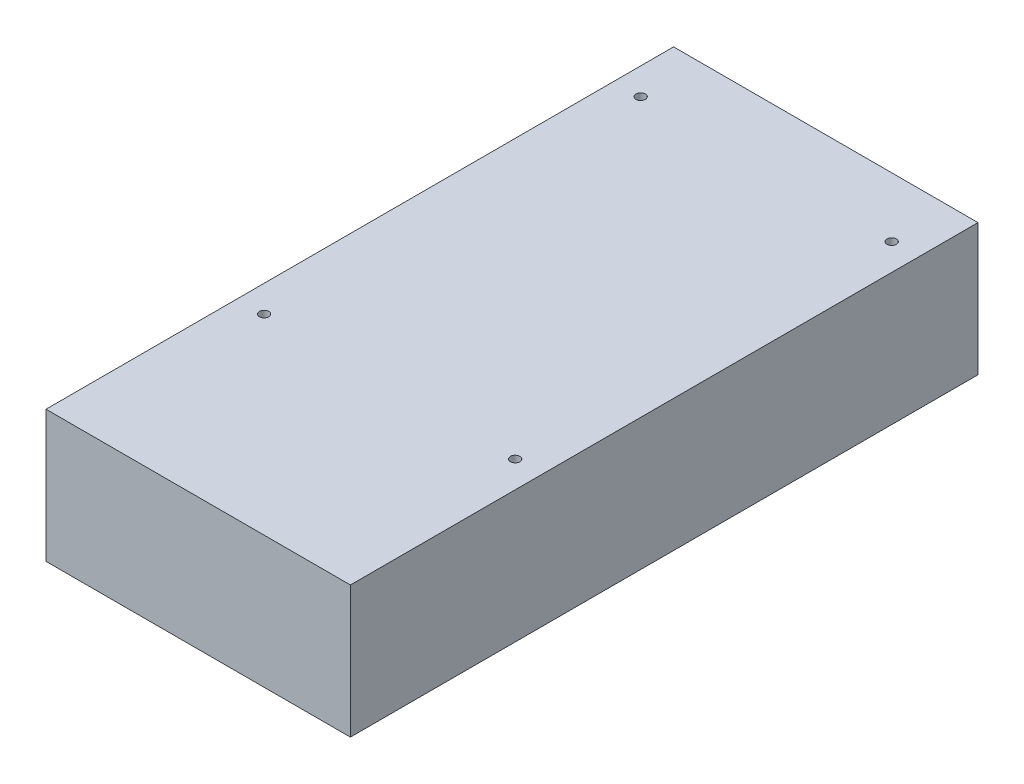
ISO-10303-21;
HEADER;
FILE_DESCRIPTION(('STEP AP214'),'2;1');
FILE_NAME('part.step','',(''),(''),'','','');
FILE_SCHEMA(('AUTOMOTIVE_DESIGN { 1 0 10303 214 1 1 1 1 }'));
ENDSEC;
DATA;
#1=APPLICATION_CONTEXT('core data for automotive mechanical design processes');
#2=APPLICATION_PROTOCOL_DEFINITION('international standard','automotive_design',2000,#1);
#3=PRODUCT_CONTEXT('',#1,'mechanical');
#4=PRODUCT('Part','Part','',(#3));
#5=PRODUCT_RELATED_PRODUCT_CATEGORY('part','',(#4));
#6=PRODUCT_DEFINITION_FORMATION('','',#4);
#7=PRODUCT_DEFINITION_CONTEXT('part definition',#1,'design');
#8=PRODUCT_DEFINITION('design','',#6,#7);
#9=PRODUCT_DEFINITION_SHAPE('','',#8);
#10=(LENGTH_UNIT() NAMED_UNIT(*) SI_UNIT(.MILLI.,.METRE.));
#11=(NAMED_UNIT(*) PLANE_ANGLE_UNIT() SI_UNIT($,.RADIAN.));
#12=(NAMED_UNIT(*) SI_UNIT($,.STERADIAN.) SOLID_ANGLE_UNIT());
#13=UNCERTAINTY_MEASURE_WITH_UNIT(LENGTH_MEASURE(1.E-05),#10,'distance_accuracy_value','');
#14=(GEOMETRIC_REPRESENTATION_CONTEXT(3) GLOBAL_UNCERTAINTY_ASSIGNED_CONTEXT((#13)) GLOBAL_UNIT_ASSIGNED_CONTEXT((#10,
#11,#12)) REPRESENTATION_CONTEXT('',''));
#15=CARTESIAN_POINT('',(0.,0.,0.));
#16=DIRECTION('',(0.,0.,1.));
#17=DIRECTION('',(1.,0.,0.));
#18=AXIS2_PLACEMENT_3D('',#15,#16,#17);
#19=CARTESIAN_POINT('',(0.,42.,0.));
#20=DIRECTION('',(1.,0.,0.));
#21=DIRECTION('',(0.,0.,-1.));
#22=AXIS2_PLACEMENT_3D('',#19,#20,#21);
#23=PLANE('',#22);
#24=DIRECTION('',(0.,0.,1.));
#25=VECTOR('',#24,1.);
#26=CARTESIAN_POINT('',(0.,0.,0.));
#27=LINE('',#26,#25);
#28=CARTESIAN_POINT('',(0.,0.,-200.));
#29=VERTEX_POINT('',#28);
#30=CARTESIAN_POINT('',(0.,0.,0.));
#31=VERTEX_POINT('',#30);
#32=EDGE_CURVE('E113',#29,#31,#27,.T.);
#33=ORIENTED_EDGE('',*,*,#32,.T.);
#34=DIRECTION('',(0.,-1.,0.));
#35=VECTOR('',#34,1.);
#36=CARTESIAN_POINT('',(0.,42.,0.));
#37=LINE('',#36,#35);
#38=CARTESIAN_POINT('',(0.,42.,0.));
#39=VERTEX_POINT('',#38);
#40=EDGE_CURVE('E11',#39,#31,#37,.T.);
#41=ORIENTED_EDGE('',*,*,#40,.F.);
#42=DIRECTION('',(0.,0.,1.));
#43=VECTOR('',#42,1.);
#44=CARTESIAN_POINT('',(0.,42.,0.));
#45=LINE('',#44,#43);
#46=CARTESIAN_POINT('',(0.,42.,-200.));
#47=VERTEX_POINT('',#46);
#48=EDGE_CURVE('E97',#47,#39,#45,.T.);
#49=ORIENTED_EDGE('',*,*,#48,.F.);
#50=DIRECTION('',(0.,-1.,0.));
#51=VECTOR('',#50,1.);
#52=CARTESIAN_POINT('',(0.,42.,-200.));
#53=LINE('',#52,#51);
#54=EDGE_CURVE('E109',#47,#29,#53,.T.);
#55=ORIENTED_EDGE('',*,*,#54,.T.);
#56=EDGE_LOOP('',(#33,#41,#49,#55));
#57=FACE_BOUND('',#56,.T.);
#58=ADVANCED_FACE('F45',(#57),#23,.F.);
#59=CARTESIAN_POINT('',(0.,42.,0.));
#60=DIRECTION('',(0.,0.,-1.));
#61=DIRECTION('',(-1.,0.,0.));
#62=AXIS2_PLACEMENT_3D('',#59,#60,#61);
#63=PLANE('',#62);
#64=DIRECTION('',(1.,0.,0.));
#65=VECTOR('',#64,1.);
#66=CARTESIAN_POINT('',(0.,0.,0.));
#67=LINE('',#66,#65);
#68=CARTESIAN_POINT('',(97.,0.,0.));
#69=VERTEX_POINT('',#68);
#70=EDGE_CURVE('E102',#31,#69,#67,.T.);
#71=ORIENTED_EDGE('',*,*,#70,.T.);
#72=DIRECTION('',(0.,-1.,0.));
#73=VECTOR('',#72,1.);
#74=CARTESIAN_POINT('',(97.,42.,0.));
#75=LINE('',#74,#73);
#76=CARTESIAN_POINT('',(97.,42.,0.));
#77=VERTEX_POINT('',#76);
#78=EDGE_CURVE('E54',#77,#69,#75,.T.);
#79=ORIENTED_EDGE('',*,*,#78,.F.);
#80=DIRECTION('',(1.,0.,0.));
#81=VECTOR('',#80,1.);
#82=CARTESIAN_POINT('',(0.,42.,0.));
#83=LINE('',#82,#81);
#84=EDGE_CURVE('E92',#39,#77,#83,.T.);
#85=ORIENTED_EDGE('',*,*,#84,.F.);
#86=ORIENTED_EDGE('',*,*,#40,.T.);
#87=EDGE_LOOP('',(#71,#79,#85,#86));
#88=FACE_BOUND('',#87,.T.);
#89=ADVANCED_FACE('F101',(#88),#63,.F.);
#90=CARTESIAN_POINT('',(97.,42.,0.));
#91=DIRECTION('',(-1.,0.,0.));
#92=DIRECTION('',(0.,0.,1.));
#93=AXIS2_PLACEMENT_3D('',#90,#91,#92);
#94=PLANE('',#93);
#95=DIRECTION('',(0.,0.,-1.));
#96=VECTOR('',#95,1.);
#97=CARTESIAN_POINT('',(97.,0.,0.));
#98=LINE('',#97,#96);
#99=CARTESIAN_POINT('',(97.,0.,-200.));
#100=VERTEX_POINT('',#99);
#101=EDGE_CURVE('E79',#69,#100,#98,.T.);
#102=ORIENTED_EDGE('',*,*,#101,.T.);
#103=DIRECTION('',(0.,-1.,0.));
#104=VECTOR('',#103,1.);
#105=CARTESIAN_POINT('',(97.,42.,-200.));
#106=LINE('',#105,#104);
#107=CARTESIAN_POINT('',(97.,42.,-200.));
#108=VERTEX_POINT('',#107);
#109=EDGE_CURVE('E104',#108,#100,#106,.T.);
#110=ORIENTED_EDGE('',*,*,#109,.F.);
#111=DIRECTION('',(0.,0.,-1.));
#112=VECTOR('',#111,1.);
#113=CARTESIAN_POINT('',(97.,42.,0.));
#114=LINE('',#113,#112);
#115=EDGE_CURVE('E95',#77,#108,#114,.T.);
#116=ORIENTED_EDGE('',*,*,#115,.F.);
#117=ORIENTED_EDGE('',*,*,#78,.T.);
#118=EDGE_LOOP('',(#102,#110,#116,#117));
#119=FACE_BOUND('',#118,.T.);
#120=ADVANCED_FACE('F105',(#119),#94,.F.);
#121=CARTESIAN_POINT('',(0.,42.,-200.));
#122=DIRECTION('',(0.,0.,1.));
#123=DIRECTION('',(1.,0.,0.));
#124=AXIS2_PLACEMENT_3D('',#121,#122,#123);
#125=PLANE('',#124);
#126=DIRECTION('',(-1.,0.,0.));
#127=VECTOR('',#126,1.);
#128=CARTESIAN_POINT('',(0.,0.,-200.));
#129=LINE('',#128,#127);
#130=EDGE_CURVE('E85',#100,#29,#129,.T.);
#131=ORIENTED_EDGE('',*,*,#130,.T.);
#132=ORIENTED_EDGE('',*,*,#54,.F.);
#133=DIRECTION('',(-1.,0.,0.));
#134=VECTOR('',#133,1.);
#135=CARTESIAN_POINT('',(0.,42.,-200.));
#136=LINE('',#135,#134);
#137=EDGE_CURVE('E62',#108,#47,#136,.T.);
#138=ORIENTED_EDGE('',*,*,#137,.F.);
#139=ORIENTED_EDGE('',*,*,#109,.T.);
#140=EDGE_LOOP('',(#131,#132,#138,#139));
#141=FACE_BOUND('',#140,.T.);
#142=ADVANCED_FACE('F127',(#141),#125,.F.);
#143=CARTESIAN_POINT('',(0.,42.,0.));
#144=DIRECTION('',(0.,-1.,0.));
#145=DIRECTION('',(0.,0.,-1.));
#146=AXIS2_PLACEMENT_3D('',#143,#144,#145);
#147=PLANE('',#146);
#148=CARTESIAN_POINT('',(8.49999999999999,42.,-61.));
#149=DIRECTION('',(0.,1.,0.));
#150=DIRECTION('',(0.,0.,1.));
#151=AXIS2_PLACEMENT_3D('',#148,#149,#150);
#152=CIRCLE('',#151,1.5);
#153=CARTESIAN_POINT('',(8.49999999999999,42.,-59.5));
#154=VERTEX_POINT('',#153);
#155=EDGE_CURVE('E138',#154,#154,#152,.T.);
#156=ORIENTED_EDGE('',*,*,#155,.F.);
#157=EDGE_LOOP('',(#156));
#158=FACE_BOUND('',#157,.T.);
#159=CARTESIAN_POINT('',(88.5,42.,-181.));
#160=DIRECTION('',(0.,1.,0.));
#161=DIRECTION('',(0.,0.,1.));
#162=AXIS2_PLACEMENT_3D('',#159,#160,#161);
#163=CIRCLE('',#162,1.5);
#164=CARTESIAN_POINT('',(88.5,42.,-179.5));
#165=VERTEX_POINT('',#164);
#166=EDGE_CURVE('E146',#165,#165,#163,.T.);
#167=ORIENTED_EDGE('',*,*,#166,.F.);
#168=EDGE_LOOP('',(#167));
#169=FACE_BOUND('',#168,.T.);
#170=CARTESIAN_POINT('',(8.49999999999999,42.,-181.));
#171=DIRECTION('',(0.,1.,0.));
#172=DIRECTION('',(0.,0.,1.));
#173=AXIS2_PLACEMENT_3D('',#170,#171,#172);
#174=CIRCLE('',#173,1.5);
#175=CARTESIAN_POINT('',(8.49999999999999,42.,-179.5));
#176=VERTEX_POINT('',#175);
#177=EDGE_CURVE('E147',#176,#176,#174,.T.);
#178=ORIENTED_EDGE('',*,*,#177,.F.);
#179=EDGE_LOOP('',(#178));
#180=FACE_BOUND('',#179,.T.);
#181=CARTESIAN_POINT('',(88.5,42.,-61.));
#182=DIRECTION('',(0.,1.,0.));
#183=DIRECTION('',(0.,0.,1.));
#184=AXIS2_PLACEMENT_3D('',#181,#182,#183);
#185=CIRCLE('',#184,1.5);
#186=CARTESIAN_POINT('',(88.5,42.,-59.5));
#187=VERTEX_POINT('',#186);
#188=EDGE_CURVE('E134',#187,#187,#185,.T.);
#189=ORIENTED_EDGE('',*,*,#188,.F.);
#190=EDGE_LOOP('',(#189));
#191=FACE_BOUND('',#190,.T.);
#192=ORIENTED_EDGE('',*,*,#48,.T.);
#193=ORIENTED_EDGE('',*,*,#84,.T.);
#194=ORIENTED_EDGE('',*,*,#115,.T.);
#195=ORIENTED_EDGE('',*,*,#137,.T.);
#196=EDGE_LOOP('',(#192,#193,#194,#195));
#197=FACE_BOUND('',#196,.T.);
#198=ADVANCED_FACE('F93',(#158,#169,#180,#191,#197),#147,.F.);
#199=CARTESIAN_POINT('',(0.,0.,0.));
#200=DIRECTION('',(0.,-1.,0.));
#201=DIRECTION('',(0.,0.,-1.));
#202=AXIS2_PLACEMENT_3D('',#199,#200,#201);
#203=PLANE('',#202);
#204=ORIENTED_EDGE('',*,*,#32,.F.);
#205=ORIENTED_EDGE('',*,*,#130,.F.);
#206=ORIENTED_EDGE('',*,*,#101,.F.);
#207=ORIENTED_EDGE('',*,*,#70,.F.);
#208=EDGE_LOOP('',(#204,#205,#206,#207));
#209=FACE_BOUND('',#208,.T.);
#210=ADVANCED_FACE('F130',(#209),#203,.T.);
#211=CARTESIAN_POINT('',(88.5,39.,-61.));
#212=DIRECTION('',(0.,1.,0.));
#213=DIRECTION('',(0.,0.,1.));
#214=AXIS2_PLACEMENT_3D('',#211,#212,#213);
#215=CYLINDRICAL_SURFACE('',#214,1.5);
#216=CARTESIAN_POINT('',(88.5,39.,-61.));
#217=DIRECTION('',(0.,1.,0.));
#218=DIRECTION('',(0.,0.,1.));
#219=AXIS2_PLACEMENT_3D('',#216,#217,#218);
#220=CIRCLE('',#219,1.5);
#221=CARTESIAN_POINT('',(88.5,39.,-59.5));
#222=VERTEX_POINT('',#221);
#223=EDGE_CURVE('E117',#222,#222,#220,.T.);
#224=ORIENTED_EDGE('',*,*,#223,.F.);
#225=EDGE_LOOP('',(#224));
#226=FACE_BOUND('',#225,.T.);
#227=ORIENTED_EDGE('',*,*,#188,.T.);
#228=EDGE_LOOP('',(#227));
#229=FACE_BOUND('',#228,.T.);
#230=ADVANCED_FACE('F174',(#226,#229),#215,.F.);
#231=CARTESIAN_POINT('',(88.5,39.,-61.));
#232=DIRECTION('',(0.,1.,0.));
#233=DIRECTION('',(0.,0.,1.));
#234=AXIS2_PLACEMENT_3D('',#231,#232,#233);
#235=PLANE('',#234);
#236=ORIENTED_EDGE('',*,*,#223,.T.);
#237=EDGE_LOOP('',(#236));
#238=FACE_BOUND('',#237,.T.);
#239=ADVANCED_FACE('F176',(#238),#235,.T.);
#240=CARTESIAN_POINT('',(8.49999999999999,39.,-181.));
#241=DIRECTION('',(0.,1.,0.));
#242=DIRECTION('',(0.,0.,1.));
#243=AXIS2_PLACEMENT_3D('',#240,#241,#242);
#244=CYLINDRICAL_SURFACE('',#243,1.5);
#245=CARTESIAN_POINT('',(8.49999999999999,39.,-181.));
#246=DIRECTION('',(0.,1.,0.));
#247=DIRECTION('',(0.,0.,1.));
#248=AXIS2_PLACEMENT_3D('',#245,#246,#247);
#249=CIRCLE('',#248,1.5);
#250=CARTESIAN_POINT('',(8.49999999999999,39.,-179.5));
#251=VERTEX_POINT('',#250);
#252=EDGE_CURVE('E158',#251,#251,#249,.T.);
#253=ORIENTED_EDGE('',*,*,#252,.F.);
#254=EDGE_LOOP('',(#253));
#255=FACE_BOUND('',#254,.T.);
#256=ORIENTED_EDGE('',*,*,#177,.T.);
#257=EDGE_LOOP('',(#256));
#258=FACE_BOUND('',#257,.T.);
#259=ADVANCED_FACE('F166',(#255,#258),#244,.F.);
#260=CARTESIAN_POINT('',(8.49999999999999,39.,-181.));
#261=DIRECTION('',(0.,1.,0.));
#262=DIRECTION('',(0.,0.,1.));
#263=AXIS2_PLACEMENT_3D('',#260,#261,#262);
#264=PLANE('',#263);
#265=ORIENTED_EDGE('',*,*,#252,.T.);
#266=EDGE_LOOP('',(#265));
#267=FACE_BOUND('',#266,.T.);
#268=ADVANCED_FACE('F232',(#267),#264,.T.);
#269=CARTESIAN_POINT('',(88.5,39.,-181.));
#270=DIRECTION('',(0.,1.,0.));
#271=DIRECTION('',(0.,0.,1.));
#272=AXIS2_PLACEMENT_3D('',#269,#270,#271);
#273=CYLINDRICAL_SURFACE('',#272,1.5);
#274=CARTESIAN_POINT('',(88.5,39.,-181.));
#275=DIRECTION('',(0.,1.,0.));
#276=DIRECTION('',(0.,0.,1.));
#277=AXIS2_PLACEMENT_3D('',#274,#275,#276);
#278=CIRCLE('',#277,1.5);
#279=CARTESIAN_POINT('',(88.5,39.,-179.5));
#280=VERTEX_POINT('',#279);
#281=EDGE_CURVE('E142',#280,#280,#278,.T.);
#282=ORIENTED_EDGE('',*,*,#281,.F.);
#283=EDGE_LOOP('',(#282));
#284=FACE_BOUND('',#283,.T.);
#285=ORIENTED_EDGE('',*,*,#166,.T.);
#286=EDGE_LOOP('',(#285));
#287=FACE_BOUND('',#286,.T.);
#288=ADVANCED_FACE('F241',(#284,#287),#273,.F.);
#289=CARTESIAN_POINT('',(88.5,39.,-181.));
#290=DIRECTION('',(0.,1.,0.));
#291=DIRECTION('',(0.,0.,1.));
#292=AXIS2_PLACEMENT_3D('',#289,#290,#291);
#293=PLANE('',#292);
#294=ORIENTED_EDGE('',*,*,#281,.T.);
#295=EDGE_LOOP('',(#294));
#296=FACE_BOUND('',#295,.T.);
#297=ADVANCED_FACE('F250',(#296),#293,.T.);
#298=CARTESIAN_POINT('',(8.49999999999999,39.,-61.));
#299=DIRECTION('',(0.,1.,0.));
#300=DIRECTION('',(0.,0.,1.));
#301=AXIS2_PLACEMENT_3D('',#298,#299,#300);
#302=CYLINDRICAL_SURFACE('',#301,1.5);
#303=CARTESIAN_POINT('',(8.49999999999999,39.,-61.));
#304=DIRECTION('',(0.,1.,0.));
#305=DIRECTION('',(0.,0.,1.));
#306=AXIS2_PLACEMENT_3D('',#303,#304,#305);
#307=CIRCLE('',#306,1.5);
#308=CARTESIAN_POINT('',(8.49999999999999,39.,-59.5));
#309=VERTEX_POINT('',#308);
#310=EDGE_CURVE('E151',#309,#309,#307,.T.);
#311=ORIENTED_EDGE('',*,*,#310,.F.);
#312=EDGE_LOOP('',(#311));
#313=FACE_BOUND('',#312,.T.);
#314=ORIENTED_EDGE('',*,*,#155,.T.);
#315=EDGE_LOOP('',(#314));
#316=FACE_BOUND('',#315,.T.);
#317=ADVANCED_FACE('F259',(#313,#316),#302,.F.);
#318=CARTESIAN_POINT('',(8.49999999999999,39.,-61.));
#319=DIRECTION('',(0.,1.,0.));
#320=DIRECTION('',(0.,0.,1.));
#321=AXIS2_PLACEMENT_3D('',#318,#319,#320);
#322=PLANE('',#321);
#323=ORIENTED_EDGE('',*,*,#310,.T.);
#324=EDGE_LOOP('',(#323));
#325=FACE_BOUND('',#324,.T.);
#326=ADVANCED_FACE('F268',(#325),#322,.T.);
#327=CLOSED_SHELL('',(#58,#89,#120,#142,#198,#210,#230,#239,#259,#268,#288,#297,#317,#326));
#328=MANIFOLD_SOLID_BREP('B2',#327);
#329=ADVANCED_BREP_SHAPE_REPRESENTATION('',(#18,#328),#14);
#330=SHAPE_DEFINITION_REPRESENTATION(#9,#329);
ENDSEC;
END-ISO-10303-21;
